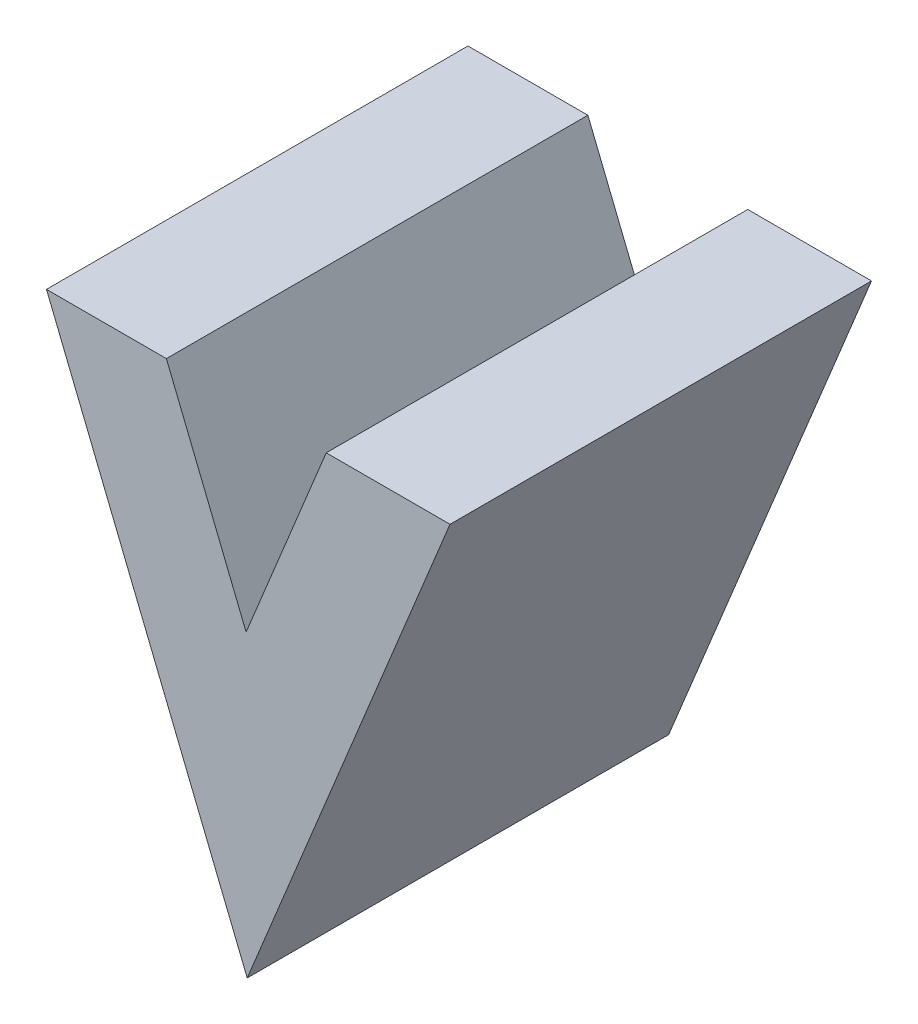
ISO-10303-21;
HEADER;
FILE_DESCRIPTION(('STEP AP214'),'2;1');
FILE_NAME('part.step','',(''),(''),'','','');
FILE_SCHEMA(('AUTOMOTIVE_DESIGN { 1 0 10303 214 1 1 1 1 }'));
ENDSEC;
DATA;
#1=APPLICATION_CONTEXT('core data for automotive mechanical design processes');
#2=APPLICATION_PROTOCOL_DEFINITION('international standard','automotive_design',2000,#1);
#3=PRODUCT_CONTEXT('',#1,'mechanical');
#4=PRODUCT('Part','Part','',(#3));
#5=PRODUCT_RELATED_PRODUCT_CATEGORY('part','',(#4));
#6=PRODUCT_DEFINITION_FORMATION('','',#4);
#7=PRODUCT_DEFINITION_CONTEXT('part definition',#1,'design');
#8=PRODUCT_DEFINITION('design','',#6,#7);
#9=PRODUCT_DEFINITION_SHAPE('','',#8);
#10=(LENGTH_UNIT() NAMED_UNIT(*) SI_UNIT(.MILLI.,.METRE.));
#11=(NAMED_UNIT(*) PLANE_ANGLE_UNIT() SI_UNIT($,.RADIAN.));
#12=(NAMED_UNIT(*) SI_UNIT($,.STERADIAN.) SOLID_ANGLE_UNIT());
#13=UNCERTAINTY_MEASURE_WITH_UNIT(LENGTH_MEASURE(1.E-05),#10,'distance_accuracy_value','');
#14=(GEOMETRIC_REPRESENTATION_CONTEXT(3) GLOBAL_UNCERTAINTY_ASSIGNED_CONTEXT((#13)) GLOBAL_UNIT_ASSIGNED_CONTEXT((#10,
#11,#12)) REPRESENTATION_CONTEXT('',''));
#15=CARTESIAN_POINT('',(0.,0.,0.));
#16=DIRECTION('',(0.,0.,1.));
#17=DIRECTION('',(1.,0.,0.));
#18=AXIS2_PLACEMENT_3D('',#15,#16,#17);
#19=CARTESIAN_POINT('',(5.811543425057,1.349600538179,0.));
#20=DIRECTION('',(-0.92697909217581,-0.375112999866588,0.));
#21=DIRECTION('',(0.375112999866588,-0.92697909217581,0.));
#22=AXIS2_PLACEMENT_3D('',#19,#20,#21);
#23=PLANE('',#22);
#24=DIRECTION('',(0.375112999866588,-0.92697909217581,0.));
#25=VECTOR('',#24,1.);
#26=CARTESIAN_POINT('',(5.811543425057,1.349600538179,0.));
#27=LINE('',#26,#25);
#28=CARTESIAN_POINT('',(5.811543425057,1.349600538179,0.));
#29=VERTEX_POINT('',#28);
#30=CARTESIAN_POINT('',(5.859164503354,1.231919348928,0.));
#31=VERTEX_POINT('',#30);
#32=EDGE_CURVE('E11',#29,#31,#27,.T.);
#33=ORIENTED_EDGE('',*,*,#32,.T.);
#34=DIRECTION('',(0.,0.,1.));
#35=VECTOR('',#34,1.);
#36=CARTESIAN_POINT('',(5.859164503354,1.231919348928,0.));
#37=LINE('',#36,#35);
#38=CARTESIAN_POINT('',(5.859164503354,1.231919348928,0.1));
#39=VERTEX_POINT('',#38);
#40=EDGE_CURVE('E24',#31,#39,#37,.T.);
#41=ORIENTED_EDGE('',*,*,#40,.T.);
#42=DIRECTION('',(0.375112999866588,-0.92697909217581,0.));
#43=VECTOR('',#42,1.);
#44=CARTESIAN_POINT('',(5.811543425057,1.349600538179,0.1));
#45=LINE('',#44,#43);
#46=CARTESIAN_POINT('',(5.811543425057,1.349600538179,0.1));
#47=VERTEX_POINT('',#46);
#48=EDGE_CURVE('E88',#47,#39,#45,.T.);
#49=ORIENTED_EDGE('',*,*,#48,.F.);
#50=DIRECTION('',(0.,0.,1.));
#51=VECTOR('',#50,1.);
#52=CARTESIAN_POINT('',(5.811543425057,1.349600538179,0.));
#53=LINE('',#52,#51);
#54=EDGE_CURVE('E116',#29,#47,#53,.T.);
#55=ORIENTED_EDGE('',*,*,#54,.F.);
#56=EDGE_LOOP('',(#33,#41,#49,#55));
#57=FACE_BOUND('',#56,.T.);
#58=ADVANCED_FACE('F17',(#57),#23,.T.);
#59=CARTESIAN_POINT('',(5.839991385118,1.349600538179,0.));
#60=DIRECTION('',(0.,1.,0.));
#61=DIRECTION('',(-1.,0.,0.));
#62=AXIS2_PLACEMENT_3D('',#59,#60,#61);
#63=PLANE('',#62);
#64=DIRECTION('',(-1.,0.,0.));
#65=VECTOR('',#64,1.);
#66=CARTESIAN_POINT('',(5.839991385118,1.349600538179,0.));
#67=LINE('',#66,#65);
#68=CARTESIAN_POINT('',(5.839991385118,1.349600538179,0.));
#69=VERTEX_POINT('',#68);
#70=EDGE_CURVE('E113',#69,#29,#67,.T.);
#71=ORIENTED_EDGE('',*,*,#70,.T.);
#72=ORIENTED_EDGE('',*,*,#54,.T.);
#73=DIRECTION('',(-1.,0.,0.));
#74=VECTOR('',#73,1.);
#75=CARTESIAN_POINT('',(5.839991385118,1.349600538179,0.1));
#76=LINE('',#75,#74);
#77=CARTESIAN_POINT('',(5.839991385118,1.349600538179,0.1));
#78=VERTEX_POINT('',#77);
#79=EDGE_CURVE('E111',#78,#47,#76,.T.);
#80=ORIENTED_EDGE('',*,*,#79,.F.);
#81=DIRECTION('',(0.,0.,1.));
#82=VECTOR('',#81,1.);
#83=CARTESIAN_POINT('',(5.839991385118,1.349600538179,0.));
#84=LINE('',#83,#82);
#85=EDGE_CURVE('E108',#69,#78,#84,.T.);
#86=ORIENTED_EDGE('',*,*,#85,.F.);
#87=EDGE_LOOP('',(#71,#72,#80,#86));
#88=FACE_BOUND('',#87,.T.);
#89=ADVANCED_FACE('F127',(#88),#63,.T.);
#90=CARTESIAN_POINT('',(5.858904189363,1.302863224048,0.));
#91=DIRECTION('',(0.926979092175829,0.375112999866541,0.));
#92=DIRECTION('',(-0.375112999866541,0.926979092175829,0.));
#93=AXIS2_PLACEMENT_3D('',#90,#91,#92);
#94=PLANE('',#93);
#95=DIRECTION('',(-0.375112999866541,0.926979092175829,0.));
#96=VECTOR('',#95,1.);
#97=CARTESIAN_POINT('',(5.858904189363,1.302863224048,0.));
#98=LINE('',#97,#96);
#99=CARTESIAN_POINT('',(5.858904189363,1.302863224048,0.));
#100=VERTEX_POINT('',#99);
#101=EDGE_CURVE('E105',#100,#69,#98,.T.);
#102=ORIENTED_EDGE('',*,*,#101,.T.);
#103=ORIENTED_EDGE('',*,*,#85,.T.);
#104=DIRECTION('',(-0.375112999866541,0.926979092175829,0.));
#105=VECTOR('',#104,1.);
#106=CARTESIAN_POINT('',(5.858904189363,1.302863224048,0.1));
#107=LINE('',#106,#105);
#108=CARTESIAN_POINT('',(5.858904189363,1.302863224048,0.1));
#109=VERTEX_POINT('',#108);
#110=EDGE_CURVE('E102',#109,#78,#107,.T.);
#111=ORIENTED_EDGE('',*,*,#110,.F.);
#112=DIRECTION('',(0.,0.,1.));
#113=VECTOR('',#112,1.);
#114=CARTESIAN_POINT('',(5.858904189363,1.302863224048,0.));
#115=LINE('',#114,#113);
#116=EDGE_CURVE('E99',#100,#109,#115,.T.);
#117=ORIENTED_EDGE('',*,*,#116,.F.);
#118=EDGE_LOOP('',(#102,#103,#111,#117));
#119=FACE_BOUND('',#118,.T.);
#120=ADVANCED_FACE('F124',(#119),#94,.T.);
#121=CARTESIAN_POINT('',(5.877916966029,1.349203372272,0.));
#122=DIRECTION('',(-0.925158566200216,0.379580857507806,0.));
#123=DIRECTION('',(-0.379580857507806,-0.925158566200216,0.));
#124=AXIS2_PLACEMENT_3D('',#121,#122,#123);
#125=PLANE('',#124);
#126=DIRECTION('',(-0.379580857507806,-0.925158566200216,0.));
#127=VECTOR('',#126,1.);
#128=CARTESIAN_POINT('',(5.877916966029,1.349203372272,0.));
#129=LINE('',#128,#127);
#130=CARTESIAN_POINT('',(5.877916966029,1.349203372272,0.));
#131=VERTEX_POINT('',#130);
#132=EDGE_CURVE('E96',#131,#100,#129,.T.);
#133=ORIENTED_EDGE('',*,*,#132,.T.);
#134=ORIENTED_EDGE('',*,*,#116,.T.);
#135=DIRECTION('',(-0.379580857507806,-0.925158566200216,0.));
#136=VECTOR('',#135,1.);
#137=CARTESIAN_POINT('',(5.877916966029,1.349203372272,0.1));
#138=LINE('',#137,#136);
#139=CARTESIAN_POINT('',(5.877916966029,1.349203372272,0.1));
#140=VERTEX_POINT('',#139);
#141=EDGE_CURVE('E94',#140,#109,#138,.T.);
#142=ORIENTED_EDGE('',*,*,#141,.F.);
#143=DIRECTION('',(0.,0.,1.));
#144=VECTOR('',#143,1.);
#145=CARTESIAN_POINT('',(5.877916966029,1.349203372272,0.));
#146=LINE('',#145,#144);
#147=EDGE_CURVE('E73',#131,#140,#146,.T.);
#148=ORIENTED_EDGE('',*,*,#147,.F.);
#149=EDGE_LOOP('',(#133,#134,#142,#148));
#150=FACE_BOUND('',#149,.T.);
#151=ADVANCED_FACE('F122',(#150),#125,.T.);
#152=CARTESIAN_POINT('',(5.907284654623,1.349203372272,0.));
#153=DIRECTION('',(0.,1.,0.));
#154=DIRECTION('',(-1.,0.,0.));
#155=AXIS2_PLACEMENT_3D('',#152,#153,#154);
#156=PLANE('',#155);
#157=DIRECTION('',(-1.,0.,0.));
#158=VECTOR('',#157,1.);
#159=CARTESIAN_POINT('',(5.907284654623,1.349203372272,0.));
#160=LINE('',#159,#158);
#161=CARTESIAN_POINT('',(5.907284654623,1.349203372272,0.));
#162=VERTEX_POINT('',#161);
#163=EDGE_CURVE('E77',#162,#131,#160,.T.);
#164=ORIENTED_EDGE('',*,*,#163,.T.);
#165=ORIENTED_EDGE('',*,*,#147,.T.);
#166=DIRECTION('',(-1.,0.,0.));
#167=VECTOR('',#166,1.);
#168=CARTESIAN_POINT('',(5.907284654623,1.349203372272,0.1));
#169=LINE('',#168,#167);
#170=CARTESIAN_POINT('',(5.907284654623,1.349203372272,0.1));
#171=VERTEX_POINT('',#170);
#172=EDGE_CURVE('E66',#171,#140,#169,.T.);
#173=ORIENTED_EDGE('',*,*,#172,.F.);
#174=DIRECTION('',(0.,0.,1.));
#175=VECTOR('',#174,1.);
#176=CARTESIAN_POINT('',(5.907284654623,1.349203372272,0.));
#177=LINE('',#176,#175);
#178=EDGE_CURVE('E70',#162,#171,#177,.T.);
#179=ORIENTED_EDGE('',*,*,#178,.F.);
#180=EDGE_LOOP('',(#164,#165,#173,#179));
#181=FACE_BOUND('',#180,.T.);
#182=ADVANCED_FACE('F69',(#181),#156,.T.);
#183=CARTESIAN_POINT('',(5.859164503354,1.231919348928,0.));
#184=DIRECTION('',(0.925158566200227,-0.379580857507779,0.));
#185=DIRECTION('',(0.379580857507779,0.925158566200227,0.));
#186=AXIS2_PLACEMENT_3D('',#183,#184,#185);
#187=PLANE('',#186);
#188=DIRECTION('',(0.379580857507779,0.925158566200227,0.));
#189=VECTOR('',#188,1.);
#190=CARTESIAN_POINT('',(5.859164503354,1.231919348928,0.));
#191=LINE('',#190,#189);
#192=EDGE_CURVE('E83',#31,#162,#191,.T.);
#193=ORIENTED_EDGE('',*,*,#192,.T.);
#194=ORIENTED_EDGE('',*,*,#178,.T.);
#195=DIRECTION('',(0.379580857507779,0.925158566200227,0.));
#196=VECTOR('',#195,1.);
#197=CARTESIAN_POINT('',(5.859164503354,1.231919348928,0.1));
#198=LINE('',#197,#196);
#199=EDGE_CURVE('E82',#39,#171,#198,.T.);
#200=ORIENTED_EDGE('',*,*,#199,.F.);
#201=ORIENTED_EDGE('',*,*,#40,.F.);
#202=EDGE_LOOP('',(#193,#194,#200,#201));
#203=FACE_BOUND('',#202,.T.);
#204=ADVANCED_FACE('F81',(#203),#187,.T.);
#205=CARTESIAN_POINT('',(5.859243249759,1.307554960357,0.1));
#206=DIRECTION('',(0.,0.,1.));
#207=DIRECTION('',(1.,0.,0.));
#208=AXIS2_PLACEMENT_3D('',#205,#206,#207);
#209=PLANE('',#208);
#210=ORIENTED_EDGE('',*,*,#199,.T.);
#211=ORIENTED_EDGE('',*,*,#172,.T.);
#212=ORIENTED_EDGE('',*,*,#141,.T.);
#213=ORIENTED_EDGE('',*,*,#110,.T.);
#214=ORIENTED_EDGE('',*,*,#79,.T.);
#215=ORIENTED_EDGE('',*,*,#48,.T.);
#216=EDGE_LOOP('',(#210,#211,#212,#213,#214,#215));
#217=FACE_BOUND('',#216,.T.);
#218=ADVANCED_FACE('F86',(#217),#209,.T.);
#219=CARTESIAN_POINT('',(5.859243249759,1.307554960357,0.));
#220=DIRECTION('',(0.,0.,1.));
#221=DIRECTION('',(1.,0.,0.));
#222=AXIS2_PLACEMENT_3D('',#219,#220,#221);
#223=PLANE('',#222);
#224=ORIENTED_EDGE('',*,*,#192,.F.);
#225=ORIENTED_EDGE('',*,*,#32,.F.);
#226=ORIENTED_EDGE('',*,*,#70,.F.);
#227=ORIENTED_EDGE('',*,*,#101,.F.);
#228=ORIENTED_EDGE('',*,*,#132,.F.);
#229=ORIENTED_EDGE('',*,*,#163,.F.);
#230=EDGE_LOOP('',(#224,#225,#226,#227,#228,#229));
#231=FACE_BOUND('',#230,.T.);
#232=ADVANCED_FACE('F119',(#231),#223,.F.);
#233=CLOSED_SHELL('',(#58,#89,#120,#151,#182,#204,#218,#232));
#234=MANIFOLD_SOLID_BREP('B1',#233);
#235=ADVANCED_BREP_SHAPE_REPRESENTATION('',(#18,#234),#14);
#236=SHAPE_DEFINITION_REPRESENTATION(#9,#235);
ENDSEC;
END-ISO-10303-21;
